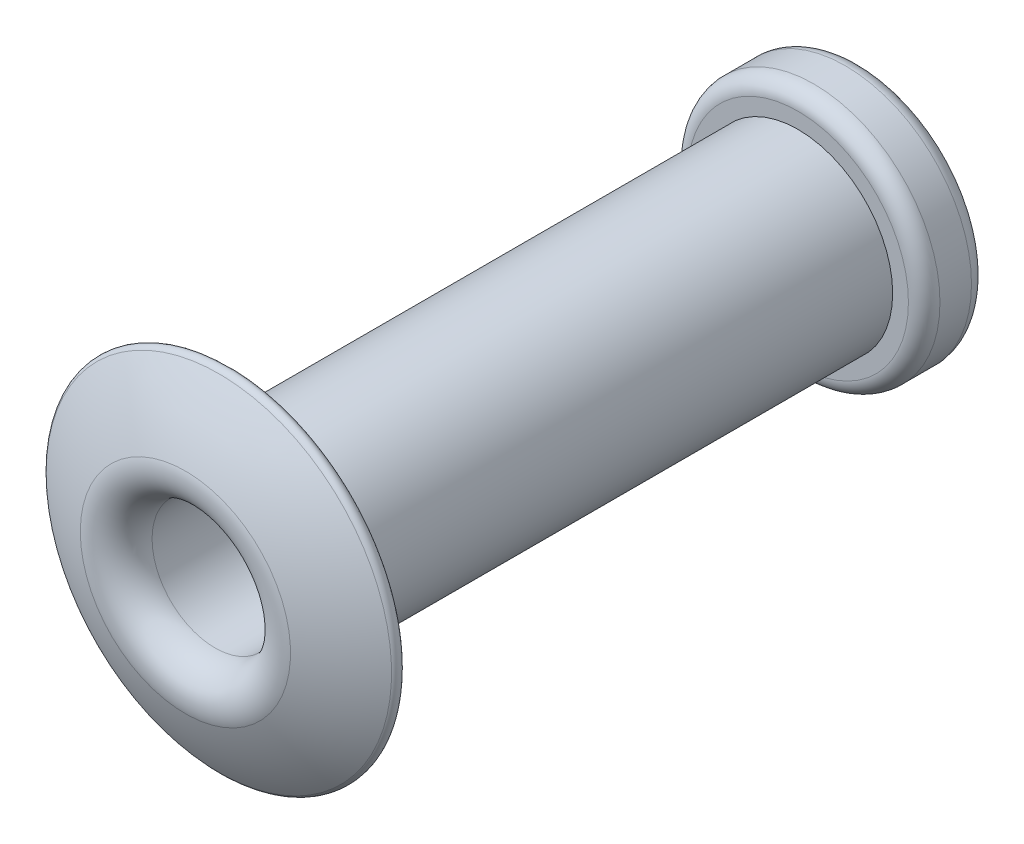
ISO-10303-21;
HEADER;
FILE_DESCRIPTION(('STEP AP214'),'2;1');
FILE_NAME('part.step','',(''),(''),'','','');
FILE_SCHEMA(('AUTOMOTIVE_DESIGN { 1 0 10303 214 1 1 1 1 }'));
ENDSEC;
DATA;
#1=APPLICATION_CONTEXT('core data for automotive mechanical design processes');
#2=APPLICATION_PROTOCOL_DEFINITION('international standard','automotive_design',2000,#1);
#3=PRODUCT_CONTEXT('',#1,'mechanical');
#4=PRODUCT('Part','Part','',(#3));
#5=PRODUCT_RELATED_PRODUCT_CATEGORY('part','',(#4));
#6=PRODUCT_DEFINITION_FORMATION('','',#4);
#7=PRODUCT_DEFINITION_CONTEXT('part definition',#1,'design');
#8=PRODUCT_DEFINITION('design','',#6,#7);
#9=PRODUCT_DEFINITION_SHAPE('','',#8);
#10=(LENGTH_UNIT() NAMED_UNIT(*) SI_UNIT(.MILLI.,.METRE.));
#11=(NAMED_UNIT(*) PLANE_ANGLE_UNIT() SI_UNIT($,.RADIAN.));
#12=(NAMED_UNIT(*) SI_UNIT($,.STERADIAN.) SOLID_ANGLE_UNIT());
#13=UNCERTAINTY_MEASURE_WITH_UNIT(LENGTH_MEASURE(1.E-05),#10,'distance_accuracy_value','');
#14=(GEOMETRIC_REPRESENTATION_CONTEXT(3) GLOBAL_UNCERTAINTY_ASSIGNED_CONTEXT((#13)) GLOBAL_UNIT_ASSIGNED_CONTEXT((#10,
#11,#12)) REPRESENTATION_CONTEXT('',''));
#15=CARTESIAN_POINT('',(0.,0.,0.));
#16=DIRECTION('',(0.,0.,1.));
#17=DIRECTION('',(1.,0.,0.));
#18=AXIS2_PLACEMENT_3D('',#15,#16,#17);
#19=CARTESIAN_POINT('',(0.,0.,5.5));
#20=DIRECTION('',(0.,0.,1.));
#21=DIRECTION('',(1.,0.,0.));
#22=AXIS2_PLACEMENT_3D('',#19,#20,#21);
#23=CYLINDRICAL_SURFACE('',#22,2.);
#24=CARTESIAN_POINT('',(0.,0.,-4.75));
#25=DIRECTION('',(0.,0.,1.));
#26=DIRECTION('',(1.,0.,0.));
#27=AXIS2_PLACEMENT_3D('',#24,#25,#26);
#28=CIRCLE('',#27,2.);
#29=CARTESIAN_POINT('',(2.,0.,-4.75));
#30=VERTEX_POINT('',#29);
#31=EDGE_CURVE('E60',#30,#30,#28,.F.);
#32=ORIENTED_EDGE('',*,*,#31,.T.);
#33=EDGE_LOOP('',(#32));
#34=FACE_BOUND('',#33,.T.);
#35=CARTESIAN_POINT('',(0.,0.,-5.25));
#36=DIRECTION('',(0.,0.,-1.));
#37=DIRECTION('',(-1.,0.,0.));
#38=AXIS2_PLACEMENT_3D('',#35,#36,#37);
#39=CIRCLE('',#38,2.);
#40=CARTESIAN_POINT('',(-2.,0.,-5.25));
#41=VERTEX_POINT('',#40);
#42=EDGE_CURVE('E63',#41,#41,#39,.F.);
#43=ORIENTED_EDGE('',*,*,#42,.T.);
#44=EDGE_LOOP('',(#43));
#45=FACE_BOUND('',#44,.T.);
#46=ADVANCED_FACE('F31',(#34,#45),#23,.T.);
#47=CARTESIAN_POINT('',(0.,0.,-5.5));
#48=DIRECTION('',(0.,0.,-1.));
#49=DIRECTION('',(-1.,0.,0.));
#50=AXIS2_PLACEMENT_3D('',#47,#48,#49);
#51=PLANE('',#50);
#52=CARTESIAN_POINT('',(0.,0.,-5.5));
#53=DIRECTION('',(0.,0.,-1.));
#54=DIRECTION('',(-1.,0.,0.));
#55=AXIS2_PLACEMENT_3D('',#52,#53,#54);
#56=CIRCLE('',#55,1.5);
#57=CARTESIAN_POINT('',(-1.5,0.,-5.5));
#58=VERTEX_POINT('',#57);
#59=EDGE_CURVE('E38',#58,#58,#56,.F.);
#60=ORIENTED_EDGE('',*,*,#59,.T.);
#61=EDGE_LOOP('',(#60));
#62=FACE_BOUND('',#61,.T.);
#63=CARTESIAN_POINT('',(0.,0.,-5.5));
#64=DIRECTION('',(0.,0.,-1.));
#65=DIRECTION('',(-1.,0.,0.));
#66=AXIS2_PLACEMENT_3D('',#63,#64,#65);
#67=CIRCLE('',#66,1.75);
#68=CARTESIAN_POINT('',(-1.75,0.,-5.5));
#69=VERTEX_POINT('',#68);
#70=EDGE_CURVE('E57',#69,#69,#67,.T.);
#71=ORIENTED_EDGE('',*,*,#70,.T.);
#72=EDGE_LOOP('',(#71));
#73=FACE_BOUND('',#72,.T.);
#74=ADVANCED_FACE('F94',(#62,#73),#51,.T.);
#75=CARTESIAN_POINT('',(0.,0.,0.5));
#76=DIRECTION('',(0.,0.,1.));
#77=DIRECTION('',(-1.,0.,0.));
#78=AXIS2_PLACEMENT_3D('',#75,#76,#77);
#79=SPHERICAL_SURFACE('',#78,5.);
#80=CARTESIAN_POINT('',(0.,0.,5.21404520791032));
#81=DIRECTION('',(0.,0.,-1.));
#82=DIRECTION('',(-1.,0.,0.));
#83=AXIS2_PLACEMENT_3D('',#80,#81,#82);
#84=CIRCLE('',#83,1.66666666666667);
#85=CARTESIAN_POINT('',(-1.66666666666667,0.,5.21404520791032));
#86=VERTEX_POINT('',#85);
#87=EDGE_CURVE('E10',#86,#86,#84,.T.);
#88=CARTESIAN_POINT('',(0.,0.,4.68367346938776));
#89=DIRECTION('',(0.,0.,-1.));
#90=DIRECTION('',(-1.,0.,0.));
#91=AXIS2_PLACEMENT_3D('',#88,#89,#90);
#92=CIRCLE('',#91,2.73804242142831);
#93=CARTESIAN_POINT('',(-2.73804242142831,0.,4.68367346938776));
#94=VERTEX_POINT('',#93);
#95=EDGE_CURVE('E54',#94,#94,#92,.F.);
#96=CARTESIAN_POINT('',(-1.66666666666667,0.,5.21404520791032));
#97=CARTESIAN_POINT('',(-1.67843540328691,0.,5.20988433217396));
#98=CARTESIAN_POINT('',(-1.69018855767433,0.,5.20567938326425));
#99=CARTESIAN_POINT('',(-1.71366304411558,0.,5.19718157885745));
#100=CARTESIAN_POINT('',(-1.7253843761694,0.,5.19288872336036));
#101=CARTESIAN_POINT('',(-1.74879456007552,0.,5.1842153455381));
#102=CARTESIAN_POINT('',(-1.76048341192781,0.,5.17983482321294));
#103=CARTESIAN_POINT('',(-1.78382797986316,0.,5.17098635773265));
#104=CARTESIAN_POINT('',(-1.7954836959462,0.,5.16651841457753));
#105=CARTESIAN_POINT('',(-1.81876133850588,0.,5.15749535798514));
#106=CARTESIAN_POINT('',(-1.83038326498251,0.,5.15294024454788));
#107=CARTESIAN_POINT('',(-1.85359267642191,0.,5.14374310292359));
#108=CARTESIAN_POINT('',(-1.86518016138467,0.,5.13910107473656));
#109=CARTESIAN_POINT('',(-1.88832003981162,0.,5.12973036399504));
#110=CARTESIAN_POINT('',(-1.8998724332758,0.,5.12500168144056));
#111=CARTESIAN_POINT('',(-1.92294148069176,0.,5.11545792721398));
#112=CARTESIAN_POINT('',(-1.93445813464353,0.,5.1106428555419));
#113=CARTESIAN_POINT('',(-1.95745505702491,0.,5.10092659317405));
#114=CARTESIAN_POINT('',(-1.96893532545453,0.,5.09602540247829));
#115=CARTESIAN_POINT('',(-1.99185883282302,0.,5.08613717698819));
#116=CARTESIAN_POINT('',(-2.00330207176191,0.,5.08115014219386));
#117=CARTESIAN_POINT('',(-2.02615087825743,0.,5.07109050824691));
#118=CARTESIAN_POINT('',(-2.03755644581407,0.,5.0660179090943));
#119=CARTESIAN_POINT('',(-2.06032926976674,0.,5.05578743097072));
#120=CARTESIAN_POINT('',(-2.07169652616277,0.,5.05062955199975));
#121=CARTESIAN_POINT('',(-2.09439209016485,0.,5.04022880356302));
#122=CARTESIAN_POINT('',(-2.10572039777089,0.,5.03498593409725));
#123=CARTESIAN_POINT('',(-2.1283374287484,0.,5.02441549876191));
#124=CARTESIAN_POINT('',(-2.13962615211987,0.,5.01908793289233));
#125=CARTESIAN_POINT('',(-2.16216338140405,0.,5.00834840359125));
#126=CARTESIAN_POINT('',(-2.17341188731676,0.,5.00293644015975));
#127=CARTESIAN_POINT('',(-2.1958680507152,0.,4.99202841931088));
#128=CARTESIAN_POINT('',(-2.20707570820092,0.,4.98653236189351));
#129=CARTESIAN_POINT('',(-2.22944954606846,0.,4.97545646136609));
#130=CARTESIAN_POINT('',(-2.24061572645028,0.,4.96987661825604));
#131=CARTESIAN_POINT('',(-2.26290598375972,0.,4.95863345933626));
#132=CARTESIAN_POINT('',(-2.27403006068734,0.,4.95297014352653));
#133=CARTESIAN_POINT('',(-2.29623548709979,0.,4.9415603568827));
#134=CARTESIAN_POINT('',(-2.30731683658462,0.,4.93581388604859));
#135=CARTESIAN_POINT('',(-2.32943618651965,0.,4.92423811169575));
#136=CARTESIAN_POINT('',(-2.34047418696985,0.,4.91840880817701));
#137=CARTESIAN_POINT('',(-2.36250621967538,0.,4.90666769544102));
#138=CARTESIAN_POINT('',(-2.3735002519307,0.,4.90075588622378));
#139=CARTESIAN_POINT('',(-2.39544373155256,0.,4.88885009370494));
#140=CARTESIAN_POINT('',(-2.40639317891909,0.,4.88285611040335));
#141=CARTESIAN_POINT('',(-2.42824687457037,0.,4.87078630593942));
#142=CARTESIAN_POINT('',(-2.43915112285512,0.,4.86471048477707));
#143=CARTESIAN_POINT('',(-2.46091380868522,0.,4.85247734540581));
#144=CARTESIAN_POINT('',(-2.47177224623058,0.,4.8463200271969));
#145=CARTESIAN_POINT('',(-2.49344270149392,0.,4.83392423911803));
#146=CARTESIAN_POINT('',(-2.50425471921189,0.,4.82768576924808));
#147=CARTESIAN_POINT('',(-2.52583172833661,0.,4.8151280277852));
#148=CARTESIAN_POINT('',(-2.53659671974335,0.,4.80880875619226));
#149=CARTESIAN_POINT('',(-2.55807907239856,0.,4.79608976575227));
#150=CARTESIAN_POINT('',(-2.56879643364702,0.,4.78969004690522));
#151=CARTESIAN_POINT('',(-2.5901829248143,0.,4.77681052094453));
#152=CARTESIAN_POINT('',(-2.60085205473312,0.,4.77033071383088));
#153=CARTESIAN_POINT('',(-2.62214148476056,0.,4.75729137479425));
#154=CARTESIAN_POINT('',(-2.63276178486918,0.,4.75073184287126));
#155=CARTESIAN_POINT('',(-2.65395295958934,0.,4.73753342223002));
#156=CARTESIAN_POINT('',(-2.66452383420088,0.,4.73089453351177));
#157=CARTESIAN_POINT('',(-2.68561556480862,0.,4.71753777142896));
#158=CARTESIAN_POINT('',(-2.69613642080481,0.,4.7108198980644));
#159=CARTESIAN_POINT('',(-2.71712752462996,0.,4.69730554444988));
#160=CARTESIAN_POINT('',(-2.72759777245892,0.,4.69050906419993));
#161=CARTESIAN_POINT('',(-2.73804242142831,0.,4.68367346938776));
#162=B_SPLINE_CURVE_WITH_KNOTS('',3,(#96,#97,#98,#99,#100,#101,#102,#103,#104,#105,#106,#107,
#108,#109,#110,#111,#112,#113,#114,#115,#116,#117,#118,#119,#120,#121,#122,#123,#124,#125,#126,
#127,#128,#129,#130,#131,#132,#133,#134,#135,#136,#137,#138,#139,#140,#141,#142,#143,#144,#145,
#146,#147,#148,#149,#150,#151,#152,#153,#154,#155,#156,#157,#158,#159,#160,#161),.UNSPECIFIED.,
.F.,.F.,(4,2,2,2,2,2,2,2,2,2,2,2,2,2,2,2,2,2,2,2,2,2,2,2,2,2,2,2,2,2,2,2,4),(0.,
0.0374478020718868,0.0748956041437736,0.112343406215661,0.149791208287548,0.187239010359435,
0.224686812431322,0.262134614503209,0.299582416575096,0.337030218646983,0.374478020718869,
0.411925822790757,0.449373624862644,0.486821426934531,0.524269229006418,0.561717031078305,
0.599164833150192,0.636612635222078,0.674060437293965,0.711508239365853,0.74895604143774,
0.786403843509626,0.823851645581514,0.861299447653401,0.898747249725288,0.936195051797174,
0.973642853869061,1.01109065594095,1.04853845801284,1.08598626008472,1.12343406215661,
1.1608818642285,1.19832966630038),.UNSPECIFIED.);
#163=EDGE_CURVE('BSEAM100',#86,#94,#162,.T.);
#164=ORIENTED_EDGE('',*,*,#87,.T.);
#165=ORIENTED_EDGE('',*,*,#95,.T.);
#166=ORIENTED_EDGE('',*,*,#163,.T.);
#167=ORIENTED_EDGE('',*,*,#163,.F.);
#168=EDGE_LOOP('',(#164,#166,#165,#167));
#169=FACE_BOUND('',#168,.T.);
#170=ADVANCED_FACE('F100',(#169),#79,.T.);
#171=CARTESIAN_POINT('',(1.5,0.,4.5));
#172=DIRECTION('',(0.,0.,-1.));
#173=DIRECTION('',(-1.,0.,0.));
#174=AXIS2_PLACEMENT_3D('',#171,#172,#173);
#175=PLANE('',#174);
#176=CARTESIAN_POINT('',(0.,0.,4.5));
#177=DIRECTION('',(0.,0.,-1.));
#178=DIRECTION('',(-1.,0.,0.));
#179=AXIS2_PLACEMENT_3D('',#176,#177,#178);
#180=CIRCLE('',#179,2.68328157299975);
#181=CARTESIAN_POINT('',(-2.68328157299975,0.,4.5));
#182=VERTEX_POINT('',#181);
#183=EDGE_CURVE('E51',#182,#182,#180,.T.);
#184=ORIENTED_EDGE('',*,*,#183,.T.);
#185=EDGE_LOOP('',(#184));
#186=FACE_BOUND('',#185,.T.);
#187=CARTESIAN_POINT('',(0.,0.,4.5));
#188=DIRECTION('',(0.,0.,1.));
#189=DIRECTION('',(1.,0.,0.));
#190=AXIS2_PLACEMENT_3D('',#187,#188,#189);
#191=CIRCLE('',#190,1.5);
#192=CARTESIAN_POINT('',(1.5,0.,4.5));
#193=VERTEX_POINT('',#192);
#194=EDGE_CURVE('E69',#193,#193,#191,.T.);
#195=ORIENTED_EDGE('',*,*,#194,.T.);
#196=EDGE_LOOP('',(#195));
#197=FACE_BOUND('',#196,.T.);
#198=ADVANCED_FACE('F91',(#186,#197),#175,.T.);
#199=CARTESIAN_POINT('',(0.,0.,5.5));
#200=DIRECTION('',(0.,0.,1.));
#201=DIRECTION('',(1.,0.,0.));
#202=AXIS2_PLACEMENT_3D('',#199,#200,#201);
#203=CYLINDRICAL_SURFACE('',#202,1.5);
#204=CARTESIAN_POINT('',(0.,0.,-4.5));
#205=DIRECTION('',(0.,0.,1.));
#206=DIRECTION('',(1.,0.,0.));
#207=AXIS2_PLACEMENT_3D('',#204,#205,#206);
#208=CIRCLE('',#207,1.5);
#209=CARTESIAN_POINT('',(1.5,0.,-4.5));
#210=VERTEX_POINT('',#209);
#211=EDGE_CURVE('E72',#210,#210,#208,.T.);
#212=ORIENTED_EDGE('',*,*,#211,.T.);
#213=EDGE_LOOP('',(#212));
#214=FACE_BOUND('',#213,.T.);
#215=ORIENTED_EDGE('',*,*,#194,.F.);
#216=EDGE_LOOP('',(#215));
#217=FACE_BOUND('',#216,.T.);
#218=ADVANCED_FACE('F76',(#214,#217),#203,.T.);
#219=CARTESIAN_POINT('',(2.,0.,-4.5));
#220=DIRECTION('',(0.,0.,1.));
#221=DIRECTION('',(1.,0.,0.));
#222=AXIS2_PLACEMENT_3D('',#219,#220,#221);
#223=PLANE('',#222);
#224=CARTESIAN_POINT('',(0.,0.,-4.5));
#225=DIRECTION('',(0.,0.,1.));
#226=DIRECTION('',(1.,0.,0.));
#227=AXIS2_PLACEMENT_3D('',#224,#225,#226);
#228=CIRCLE('',#227,1.75);
#229=CARTESIAN_POINT('',(1.75,0.,-4.5));
#230=VERTEX_POINT('',#229);
#231=EDGE_CURVE('E66',#230,#230,#228,.T.);
#232=ORIENTED_EDGE('',*,*,#231,.T.);
#233=EDGE_LOOP('',(#232));
#234=FACE_BOUND('',#233,.T.);
#235=ORIENTED_EDGE('',*,*,#211,.F.);
#236=EDGE_LOOP('',(#235));
#237=FACE_BOUND('',#236,.T.);
#238=ADVANCED_FACE('F79',(#234,#237),#223,.T.);
#239=CARTESIAN_POINT('',(0.,0.,5.5));
#240=DIRECTION('',(0.,0.,-1.));
#241=DIRECTION('',(-1.,0.,0.));
#242=AXIS2_PLACEMENT_3D('',#239,#240,#241);
#243=CYLINDRICAL_SURFACE('',#242,1.);
#244=CARTESIAN_POINT('',(0.,0.,-5.));
#245=DIRECTION('',(0.,0.,-1.));
#246=DIRECTION('',(-1.,0.,0.));
#247=AXIS2_PLACEMENT_3D('',#244,#245,#246);
#248=CIRCLE('',#247,1.);
#249=CARTESIAN_POINT('',(-1.,0.,-5.));
#250=VERTEX_POINT('',#249);
#251=EDGE_CURVE('E42',#250,#250,#248,.T.);
#252=ORIENTED_EDGE('',*,*,#251,.T.);
#253=EDGE_LOOP('',(#252));
#254=FACE_BOUND('',#253,.T.);
#255=CARTESIAN_POINT('',(0.,0.,4.74264068711929));
#256=DIRECTION('',(0.,0.,-1.));
#257=DIRECTION('',(-1.,0.,0.));
#258=AXIS2_PLACEMENT_3D('',#255,#256,#257);
#259=CIRCLE('',#258,1.);
#260=CARTESIAN_POINT('',(-1.,0.,4.74264068711929));
#261=VERTEX_POINT('',#260);
#262=EDGE_CURVE('E46',#261,#261,#259,.F.);
#263=ORIENTED_EDGE('',*,*,#262,.T.);
#264=EDGE_LOOP('',(#263));
#265=FACE_BOUND('',#264,.T.);
#266=ADVANCED_FACE('F81',(#254,#265),#243,.F.);
#267=CARTESIAN_POINT('',(0.,0.,-4.75));
#268=DIRECTION('',(0.,0.,1.));
#269=DIRECTION('',(1.,0.,0.));
#270=AXIS2_PLACEMENT_3D('',#267,#268,#269);
#271=TOROIDAL_SURFACE('',#270,1.75,0.25);
#272=ORIENTED_EDGE('',*,*,#31,.F.);
#273=EDGE_LOOP('',(#272));
#274=FACE_BOUND('',#273,.T.);
#275=ORIENTED_EDGE('',*,*,#231,.F.);
#276=EDGE_LOOP('',(#275));
#277=FACE_BOUND('',#276,.T.);
#278=ADVANCED_FACE('F88',(#274,#277),#271,.T.);
#279=CARTESIAN_POINT('',(0.,0.,-5.25));
#280=DIRECTION('',(0.,0.,-1.));
#281=DIRECTION('',(-1.,0.,0.));
#282=AXIS2_PLACEMENT_3D('',#279,#280,#281);
#283=TOROIDAL_SURFACE('',#282,1.75,0.25);
#284=ORIENTED_EDGE('',*,*,#70,.F.);
#285=EDGE_LOOP('',(#284));
#286=FACE_BOUND('',#285,.T.);
#287=ORIENTED_EDGE('',*,*,#42,.F.);
#288=EDGE_LOOP('',(#287));
#289=FACE_BOUND('',#288,.T.);
#290=ADVANCED_FACE('F107',(#286,#289),#283,.T.);
#291=CARTESIAN_POINT('',(0.,0.,4.6));
#292=DIRECTION('',(0.,0.,-1.));
#293=DIRECTION('',(-1.,0.,0.));
#294=AXIS2_PLACEMENT_3D('',#291,#292,#293);
#295=TOROIDAL_SURFACE('',#294,2.68328157299975,0.1);
#296=ORIENTED_EDGE('',*,*,#183,.F.);
#297=EDGE_LOOP('',(#296));
#298=FACE_BOUND('',#297,.T.);
#299=ORIENTED_EDGE('',*,*,#95,.F.);
#300=EDGE_LOOP('',(#299));
#301=FACE_BOUND('',#300,.T.);
#302=ADVANCED_FACE('F111',(#298,#301),#295,.T.);
#303=CARTESIAN_POINT('',(0.,0.,-5.));
#304=DIRECTION('',(0.,0.,-1.));
#305=DIRECTION('',(-1.,0.,0.));
#306=AXIS2_PLACEMENT_3D('',#303,#304,#305);
#307=TOROIDAL_SURFACE('',#306,1.5,0.5);
#308=ORIENTED_EDGE('',*,*,#59,.F.);
#309=EDGE_LOOP('',(#308));
#310=FACE_BOUND('',#309,.T.);
#311=ORIENTED_EDGE('',*,*,#251,.F.);
#312=EDGE_LOOP('',(#311));
#313=FACE_BOUND('',#312,.T.);
#314=ADVANCED_FACE('F114',(#310,#313),#307,.T.);
#315=CARTESIAN_POINT('',(0.,0.,4.74264068711929));
#316=DIRECTION('',(0.,0.,-1.));
#317=DIRECTION('',(-1.,0.,0.));
#318=AXIS2_PLACEMENT_3D('',#315,#316,#317);
#319=TOROIDAL_SURFACE('',#318,1.5,0.5);
#320=ORIENTED_EDGE('',*,*,#87,.F.);
#321=EDGE_LOOP('',(#320));
#322=FACE_BOUND('',#321,.T.);
#323=ORIENTED_EDGE('',*,*,#262,.F.);
#324=EDGE_LOOP('',(#323));
#325=FACE_BOUND('',#324,.T.);
#326=ADVANCED_FACE('F33',(#322,#325),#319,.T.);
#327=CLOSED_SHELL('',(#46,#74,#170,#198,#218,#238,#266,#278,#290,#302,#314,#326));
#328=MANIFOLD_SOLID_BREP('B2',#327);
#329=ADVANCED_BREP_SHAPE_REPRESENTATION('',(#18,#328),#14);
#330=SHAPE_DEFINITION_REPRESENTATION(#9,#329);
ENDSEC;
END-ISO-10303-21;
